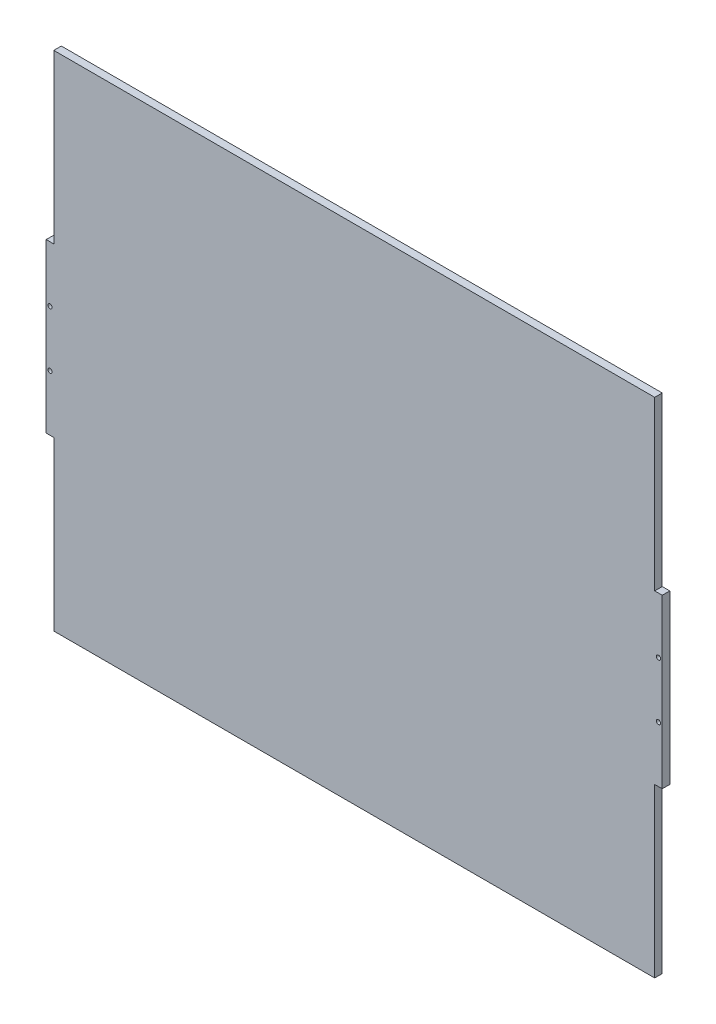
ISO-10303-21;
HEADER;
FILE_DESCRIPTION(('STEP AP214'),'2;1');
FILE_NAME('part.step','',(''),(''),'','','');
FILE_SCHEMA(('AUTOMOTIVE_DESIGN { 1 0 10303 214 1 1 1 1 }'));
ENDSEC;
DATA;
#1=APPLICATION_CONTEXT('core data for automotive mechanical design processes');
#2=APPLICATION_PROTOCOL_DEFINITION('international standard','automotive_design',2000,#1);
#3=PRODUCT_CONTEXT('',#1,'mechanical');
#4=PRODUCT('Part','Part','',(#3));
#5=PRODUCT_RELATED_PRODUCT_CATEGORY('part','',(#4));
#6=PRODUCT_DEFINITION_FORMATION('','',#4);
#7=PRODUCT_DEFINITION_CONTEXT('part definition',#1,'design');
#8=PRODUCT_DEFINITION('design','',#6,#7);
#9=PRODUCT_DEFINITION_SHAPE('','',#8);
#10=(LENGTH_UNIT() NAMED_UNIT(*) SI_UNIT(.MILLI.,.METRE.));
#11=(NAMED_UNIT(*) PLANE_ANGLE_UNIT() SI_UNIT($,.RADIAN.));
#12=(NAMED_UNIT(*) SI_UNIT($,.STERADIAN.) SOLID_ANGLE_UNIT());
#13=UNCERTAINTY_MEASURE_WITH_UNIT(LENGTH_MEASURE(1.E-05),#10,'distance_accuracy_value','');
#14=(GEOMETRIC_REPRESENTATION_CONTEXT(3) GLOBAL_UNCERTAINTY_ASSIGNED_CONTEXT((#13)) GLOBAL_UNIT_ASSIGNED_CONTEXT((#10,
#11,#12)) REPRESENTATION_CONTEXT('',''));
#15=CARTESIAN_POINT('',(0.,0.,0.));
#16=DIRECTION('',(0.,0.,1.));
#17=DIRECTION('',(1.,0.,0.));
#18=AXIS2_PLACEMENT_3D('',#15,#16,#17);
#19=CARTESIAN_POINT('',(0.,0.,6.));
#20=DIRECTION('',(1.,0.,0.));
#21=DIRECTION('',(0.,1.,0.));
#22=AXIS2_PLACEMENT_3D('',#19,#20,#21);
#23=PLANE('',#22);
#24=DIRECTION('',(0.,-1.,0.));
#25=VECTOR('',#24,1.);
#26=CARTESIAN_POINT('',(0.,0.,6.));
#27=LINE('',#26,#25);
#28=CARTESIAN_POINT('',(0.,266.666666666667,6.));
#29=VERTEX_POINT('',#28);
#30=CARTESIAN_POINT('',(0.,133.333333333333,6.));
#31=VERTEX_POINT('',#30);
#32=EDGE_CURVE('E135',#29,#31,#27,.T.);
#33=ORIENTED_EDGE('',*,*,#32,.F.);
#34=DIRECTION('',(0.,0.,1.));
#35=VECTOR('',#34,1.);
#36=CARTESIAN_POINT('',(0.,266.666666666667,-6.));
#37=LINE('',#36,#35);
#38=CARTESIAN_POINT('',(0.,266.666666666667,0.));
#39=VERTEX_POINT('',#38);
#40=EDGE_CURVE('E118',#39,#29,#37,.T.);
#41=ORIENTED_EDGE('',*,*,#40,.F.);
#42=DIRECTION('',(0.,-1.,0.));
#43=VECTOR('',#42,1.);
#44=CARTESIAN_POINT('',(0.,0.,0.));
#45=LINE('',#44,#43);
#46=CARTESIAN_POINT('',(0.,133.333333333333,0.));
#47=VERTEX_POINT('',#46);
#48=EDGE_CURVE('E156',#39,#47,#45,.T.);
#49=ORIENTED_EDGE('',*,*,#48,.T.);
#50=DIRECTION('',(0.,0.,1.));
#51=VECTOR('',#50,1.);
#52=CARTESIAN_POINT('',(0.,133.333333333333,-6.));
#53=LINE('',#52,#51);
#54=EDGE_CURVE('E136',#47,#31,#53,.T.);
#55=ORIENTED_EDGE('',*,*,#54,.T.);
#56=EDGE_LOOP('',(#33,#41,#49,#55));
#57=FACE_BOUND('',#56,.T.);
#58=ADVANCED_FACE('F33',(#57),#23,.F.);
#59=CARTESIAN_POINT('',(0.,0.,6.));
#60=DIRECTION('',(0.,1.,0.));
#61=DIRECTION('',(0.,0.,1.));
#62=AXIS2_PLACEMENT_3D('',#59,#60,#61);
#63=PLANE('',#62);
#64=DIRECTION('',(1.,0.,0.));
#65=VECTOR('',#64,1.);
#66=CARTESIAN_POINT('',(0.,0.,6.));
#67=LINE('',#66,#65);
#68=CARTESIAN_POINT('',(6.00000000000006,0.,6.));
#69=VERTEX_POINT('',#68);
#70=CARTESIAN_POINT('',(484.,0.,6.));
#71=VERTEX_POINT('',#70);
#72=EDGE_CURVE('E139',#69,#71,#67,.T.);
#73=ORIENTED_EDGE('',*,*,#72,.F.);
#74=DIRECTION('',(0.,0.,1.));
#75=VECTOR('',#74,1.);
#76=CARTESIAN_POINT('',(6.00000000000006,0.,-6.));
#77=LINE('',#76,#75);
#78=CARTESIAN_POINT('',(6.00000000000006,0.,0.));
#79=VERTEX_POINT('',#78);
#80=EDGE_CURVE('E186',#79,#69,#77,.T.);
#81=ORIENTED_EDGE('',*,*,#80,.F.);
#82=DIRECTION('',(1.,0.,0.));
#83=VECTOR('',#82,1.);
#84=CARTESIAN_POINT('',(0.,0.,0.));
#85=LINE('',#84,#83);
#86=CARTESIAN_POINT('',(484.,0.,0.));
#87=VERTEX_POINT('',#86);
#88=EDGE_CURVE('E158',#79,#87,#85,.T.);
#89=ORIENTED_EDGE('',*,*,#88,.T.);
#90=DIRECTION('',(0.,0.,1.));
#91=VECTOR('',#90,1.);
#92=CARTESIAN_POINT('',(484.,0.,-6.));
#93=LINE('',#92,#91);
#94=EDGE_CURVE('E206',#87,#71,#93,.T.);
#95=ORIENTED_EDGE('',*,*,#94,.T.);
#96=EDGE_LOOP('',(#73,#81,#89,#95));
#97=FACE_BOUND('',#96,.T.);
#98=ADVANCED_FACE('F190',(#97),#63,.F.);
#99=CARTESIAN_POINT('',(490.,0.,6.));
#100=DIRECTION('',(-1.,0.,0.));
#101=DIRECTION('',(0.,-1.,0.));
#102=AXIS2_PLACEMENT_3D('',#99,#100,#101);
#103=PLANE('',#102);
#104=DIRECTION('',(0.,1.,0.));
#105=VECTOR('',#104,1.);
#106=CARTESIAN_POINT('',(490.,0.,6.));
#107=LINE('',#106,#105);
#108=CARTESIAN_POINT('',(490.,133.333333333333,6.));
#109=VERTEX_POINT('',#108);
#110=CARTESIAN_POINT('',(490.,266.666666666667,6.));
#111=VERTEX_POINT('',#110);
#112=EDGE_CURVE('E143',#109,#111,#107,.T.);
#113=ORIENTED_EDGE('',*,*,#112,.F.);
#114=DIRECTION('',(0.,0.,1.));
#115=VECTOR('',#114,1.);
#116=CARTESIAN_POINT('',(490.,133.333333333333,-6.));
#117=LINE('',#116,#115);
#118=CARTESIAN_POINT('',(490.,133.333333333333,0.));
#119=VERTEX_POINT('',#118);
#120=EDGE_CURVE('E205',#119,#109,#117,.T.);
#121=ORIENTED_EDGE('',*,*,#120,.F.);
#122=DIRECTION('',(0.,1.,0.));
#123=VECTOR('',#122,1.);
#124=CARTESIAN_POINT('',(490.,0.,0.));
#125=LINE('',#124,#123);
#126=CARTESIAN_POINT('',(490.,266.666666666667,0.));
#127=VERTEX_POINT('',#126);
#128=EDGE_CURVE('E146',#119,#127,#125,.T.);
#129=ORIENTED_EDGE('',*,*,#128,.T.);
#130=DIRECTION('',(0.,0.,1.));
#131=VECTOR('',#130,1.);
#132=CARTESIAN_POINT('',(490.,266.666666666667,-6.));
#133=LINE('',#132,#131);
#134=EDGE_CURVE('E159',#127,#111,#133,.T.);
#135=ORIENTED_EDGE('',*,*,#134,.T.);
#136=EDGE_LOOP('',(#113,#121,#129,#135));
#137=FACE_BOUND('',#136,.T.);
#138=ADVANCED_FACE('F248',(#137),#103,.F.);
#139=CARTESIAN_POINT('',(0.,400.,6.));
#140=DIRECTION('',(0.,-1.,0.));
#141=DIRECTION('',(0.,0.,-1.));
#142=AXIS2_PLACEMENT_3D('',#139,#140,#141);
#143=PLANE('',#142);
#144=DIRECTION('',(-1.,0.,0.));
#145=VECTOR('',#144,1.);
#146=CARTESIAN_POINT('',(0.,400.,0.));
#147=LINE('',#146,#145);
#148=CARTESIAN_POINT('',(484.,400.,0.));
#149=VERTEX_POINT('',#148);
#150=CARTESIAN_POINT('',(6.00000000000001,400.,0.));
#151=VERTEX_POINT('',#150);
#152=EDGE_CURVE('E140',#149,#151,#147,.T.);
#153=ORIENTED_EDGE('',*,*,#152,.T.);
#154=DIRECTION('',(0.,0.,1.));
#155=VECTOR('',#154,1.);
#156=CARTESIAN_POINT('',(6.00000000000001,400.,-6.));
#157=LINE('',#156,#155);
#158=CARTESIAN_POINT('',(6.00000000000001,400.,6.));
#159=VERTEX_POINT('',#158);
#160=EDGE_CURVE('E215',#151,#159,#157,.T.);
#161=ORIENTED_EDGE('',*,*,#160,.T.);
#162=DIRECTION('',(-1.,0.,0.));
#163=VECTOR('',#162,1.);
#164=CARTESIAN_POINT('',(0.,400.,6.));
#165=LINE('',#164,#163);
#166=CARTESIAN_POINT('',(484.,400.,6.));
#167=VERTEX_POINT('',#166);
#168=EDGE_CURVE('E153',#167,#159,#165,.T.);
#169=ORIENTED_EDGE('',*,*,#168,.F.);
#170=DIRECTION('',(0.,0.,1.));
#171=VECTOR('',#170,1.);
#172=CARTESIAN_POINT('',(484.,400.,-6.));
#173=LINE('',#172,#171);
#174=EDGE_CURVE('E149',#149,#167,#173,.T.);
#175=ORIENTED_EDGE('',*,*,#174,.F.);
#176=EDGE_LOOP('',(#153,#161,#169,#175));
#177=FACE_BOUND('',#176,.T.);
#178=ADVANCED_FACE('F231',(#177),#143,.F.);
#179=CARTESIAN_POINT('',(0.,0.,6.));
#180=DIRECTION('',(0.,0.,-1.));
#181=DIRECTION('',(-1.,0.,0.));
#182=AXIS2_PLACEMENT_3D('',#179,#180,#181);
#183=PLANE('',#182);
#184=CARTESIAN_POINT('',(2.99999999999994,222.223333333333,6.));
#185=DIRECTION('',(0.,0.,1.));
#186=DIRECTION('',(1.,0.,0.));
#187=AXIS2_PLACEMENT_3D('',#184,#185,#186);
#188=CIRCLE('',#187,1.69999999999999);
#189=CARTESIAN_POINT('',(4.69999999999993,222.223333333333,6.));
#190=VERTEX_POINT('',#189);
#191=EDGE_CURVE('E282',#190,#190,#188,.T.);
#192=ORIENTED_EDGE('',*,*,#191,.F.);
#193=EDGE_LOOP('',(#192));
#194=FACE_BOUND('',#193,.T.);
#195=CARTESIAN_POINT('',(2.99999999999994,177.776666666667,6.));
#196=DIRECTION('',(0.,0.,1.));
#197=DIRECTION('',(1.,0.,0.));
#198=AXIS2_PLACEMENT_3D('',#195,#196,#197);
#199=CIRCLE('',#198,1.69999999999999);
#200=CARTESIAN_POINT('',(4.69999999999993,177.776666666667,6.));
#201=VERTEX_POINT('',#200);
#202=EDGE_CURVE('E286',#201,#201,#199,.T.);
#203=ORIENTED_EDGE('',*,*,#202,.F.);
#204=EDGE_LOOP('',(#203));
#205=FACE_BOUND('',#204,.T.);
#206=CARTESIAN_POINT('',(487.,222.223333333333,6.));
#207=DIRECTION('',(0.,0.,1.));
#208=DIRECTION('',(1.,0.,0.));
#209=AXIS2_PLACEMENT_3D('',#206,#207,#208);
#210=CIRCLE('',#209,1.69999999999998);
#211=CARTESIAN_POINT('',(488.7,222.223333333333,6.));
#212=VERTEX_POINT('',#211);
#213=EDGE_CURVE('E290',#212,#212,#210,.T.);
#214=ORIENTED_EDGE('',*,*,#213,.F.);
#215=EDGE_LOOP('',(#214));
#216=FACE_BOUND('',#215,.T.);
#217=CARTESIAN_POINT('',(487.,177.776666666667,6.));
#218=DIRECTION('',(0.,0.,1.));
#219=DIRECTION('',(1.,0.,0.));
#220=AXIS2_PLACEMENT_3D('',#217,#218,#219);
#221=CIRCLE('',#220,1.69999999999998);
#222=CARTESIAN_POINT('',(488.7,177.776666666667,6.));
#223=VERTEX_POINT('',#222);
#224=EDGE_CURVE('E293',#223,#223,#221,.T.);
#225=ORIENTED_EDGE('',*,*,#224,.F.);
#226=EDGE_LOOP('',(#225));
#227=FACE_BOUND('',#226,.T.);
#228=ORIENTED_EDGE('',*,*,#168,.T.);
#229=DIRECTION('',(0.,1.,0.));
#230=VECTOR('',#229,1.);
#231=CARTESIAN_POINT('',(6.00000000000001,400.,6.));
#232=LINE('',#231,#230);
#233=CARTESIAN_POINT('',(6.00000000000002,266.666666666667,6.));
#234=VERTEX_POINT('',#233);
#235=EDGE_CURVE('E128',#234,#159,#232,.T.);
#236=ORIENTED_EDGE('',*,*,#235,.F.);
#237=DIRECTION('',(1.,0.,0.));
#238=VECTOR('',#237,1.);
#239=CARTESIAN_POINT('',(0.,266.666666666667,6.));
#240=LINE('',#239,#238);
#241=EDGE_CURVE('E121',#29,#234,#240,.T.);
#242=ORIENTED_EDGE('',*,*,#241,.F.);
#243=ORIENTED_EDGE('',*,*,#32,.T.);
#244=DIRECTION('',(-1.,0.,0.));
#245=VECTOR('',#244,1.);
#246=CARTESIAN_POINT('',(0.,133.333333333333,6.));
#247=LINE('',#246,#245);
#248=CARTESIAN_POINT('',(6.00000000000006,133.333333333333,6.));
#249=VERTEX_POINT('',#248);
#250=EDGE_CURVE('E192',#249,#31,#247,.T.);
#251=ORIENTED_EDGE('',*,*,#250,.F.);
#252=DIRECTION('',(0.,1.,0.));
#253=VECTOR('',#252,1.);
#254=CARTESIAN_POINT('',(6.00000000000006,0.,6.));
#255=LINE('',#254,#253);
#256=EDGE_CURVE('E195',#69,#249,#255,.T.);
#257=ORIENTED_EDGE('',*,*,#256,.F.);
#258=ORIENTED_EDGE('',*,*,#72,.T.);
#259=DIRECTION('',(0.,-1.,0.));
#260=VECTOR('',#259,1.);
#261=CARTESIAN_POINT('',(484.,0.,6.));
#262=LINE('',#261,#260);
#263=CARTESIAN_POINT('',(484.,133.333333333333,6.));
#264=VERTEX_POINT('',#263);
#265=EDGE_CURVE('E202',#264,#71,#262,.T.);
#266=ORIENTED_EDGE('',*,*,#265,.F.);
#267=DIRECTION('',(-1.,0.,0.));
#268=VECTOR('',#267,1.);
#269=CARTESIAN_POINT('',(490.,133.333333333333,6.));
#270=LINE('',#269,#268);
#271=EDGE_CURVE('E199',#109,#264,#270,.T.);
#272=ORIENTED_EDGE('',*,*,#271,.F.);
#273=ORIENTED_EDGE('',*,*,#112,.T.);
#274=DIRECTION('',(1.,0.,0.));
#275=VECTOR('',#274,1.);
#276=CARTESIAN_POINT('',(490.,266.666666666667,6.));
#277=LINE('',#276,#275);
#278=CARTESIAN_POINT('',(484.,266.666666666667,6.));
#279=VERTEX_POINT('',#278);
#280=EDGE_CURVE('E214',#279,#111,#277,.T.);
#281=ORIENTED_EDGE('',*,*,#280,.F.);
#282=DIRECTION('',(0.,-1.,0.));
#283=VECTOR('',#282,1.);
#284=CARTESIAN_POINT('',(484.,400.,6.));
#285=LINE('',#284,#283);
#286=EDGE_CURVE('E211',#167,#279,#285,.T.);
#287=ORIENTED_EDGE('',*,*,#286,.F.);
#288=EDGE_LOOP('',(#228,#236,#242,#243,#251,#257,#258,#266,#272,#273,#281,#287));
#289=FACE_BOUND('',#288,.T.);
#290=ADVANCED_FACE('F133',(#194,#205,#216,#227,#289),#183,.F.);
#291=CARTESIAN_POINT('',(0.,0.,0.));
#292=DIRECTION('',(0.,0.,-1.));
#293=DIRECTION('',(-1.,0.,0.));
#294=AXIS2_PLACEMENT_3D('',#291,#292,#293);
#295=PLANE('',#294);
#296=CARTESIAN_POINT('',(2.99999999999994,222.223333333333,0.));
#297=DIRECTION('',(0.,0.,1.));
#298=DIRECTION('',(1.,0.,0.));
#299=AXIS2_PLACEMENT_3D('',#296,#297,#298);
#300=CIRCLE('',#299,1.69999999999999);
#301=CARTESIAN_POINT('',(4.69999999999993,222.223333333333,0.));
#302=VERTEX_POINT('',#301);
#303=EDGE_CURVE('E307',#302,#302,#300,.T.);
#304=ORIENTED_EDGE('',*,*,#303,.T.);
#305=EDGE_LOOP('',(#304));
#306=FACE_BOUND('',#305,.T.);
#307=CARTESIAN_POINT('',(2.99999999999994,177.776666666667,0.));
#308=DIRECTION('',(0.,0.,1.));
#309=DIRECTION('',(1.,0.,0.));
#310=AXIS2_PLACEMENT_3D('',#307,#308,#309);
#311=CIRCLE('',#310,1.69999999999999);
#312=CARTESIAN_POINT('',(4.69999999999993,177.776666666667,0.));
#313=VERTEX_POINT('',#312);
#314=EDGE_CURVE('E303',#313,#313,#311,.T.);
#315=ORIENTED_EDGE('',*,*,#314,.T.);
#316=EDGE_LOOP('',(#315));
#317=FACE_BOUND('',#316,.T.);
#318=CARTESIAN_POINT('',(487.,222.223333333333,0.));
#319=DIRECTION('',(0.,0.,1.));
#320=DIRECTION('',(1.,0.,0.));
#321=AXIS2_PLACEMENT_3D('',#318,#319,#320);
#322=CIRCLE('',#321,1.69999999999998);
#323=CARTESIAN_POINT('',(488.7,222.223333333333,0.));
#324=VERTEX_POINT('',#323);
#325=EDGE_CURVE('E295',#324,#324,#322,.T.);
#326=ORIENTED_EDGE('',*,*,#325,.T.);
#327=EDGE_LOOP('',(#326));
#328=FACE_BOUND('',#327,.T.);
#329=CARTESIAN_POINT('',(487.,177.776666666667,0.));
#330=DIRECTION('',(0.,0.,1.));
#331=DIRECTION('',(1.,0.,0.));
#332=AXIS2_PLACEMENT_3D('',#329,#330,#331);
#333=CIRCLE('',#332,1.69999999999998);
#334=CARTESIAN_POINT('',(488.7,177.776666666667,0.));
#335=VERTEX_POINT('',#334);
#336=EDGE_CURVE('E203',#335,#335,#333,.T.);
#337=ORIENTED_EDGE('',*,*,#336,.T.);
#338=EDGE_LOOP('',(#337));
#339=FACE_BOUND('',#338,.T.);
#340=DIRECTION('',(0.,-1.,0.));
#341=VECTOR('',#340,1.);
#342=CARTESIAN_POINT('',(6.00000000000006,0.,0.));
#343=LINE('',#342,#341);
#344=CARTESIAN_POINT('',(6.00000000000002,266.666666666667,0.));
#345=VERTEX_POINT('',#344);
#346=EDGE_CURVE('E11',#151,#345,#343,.T.);
#347=ORIENTED_EDGE('',*,*,#346,.F.);
#348=ORIENTED_EDGE('',*,*,#152,.F.);
#349=DIRECTION('',(0.,1.,0.));
#350=VECTOR('',#349,1.);
#351=CARTESIAN_POINT('',(484.,0.,0.));
#352=LINE('',#351,#350);
#353=CARTESIAN_POINT('',(484.,266.666666666667,0.));
#354=VERTEX_POINT('',#353);
#355=EDGE_CURVE('E155',#354,#149,#352,.T.);
#356=ORIENTED_EDGE('',*,*,#355,.F.);
#357=DIRECTION('',(-1.,0.,0.));
#358=VECTOR('',#357,1.);
#359=CARTESIAN_POINT('',(0.,266.666666666667,0.));
#360=LINE('',#359,#358);
#361=EDGE_CURVE('E164',#127,#354,#360,.T.);
#362=ORIENTED_EDGE('',*,*,#361,.F.);
#363=ORIENTED_EDGE('',*,*,#128,.F.);
#364=DIRECTION('',(1.,0.,0.));
#365=VECTOR('',#364,1.);
#366=CARTESIAN_POINT('',(0.,133.333333333333,0.));
#367=LINE('',#366,#365);
#368=CARTESIAN_POINT('',(484.,133.333333333333,0.));
#369=VERTEX_POINT('',#368);
#370=EDGE_CURVE('E167',#369,#119,#367,.T.);
#371=ORIENTED_EDGE('',*,*,#370,.F.);
#372=DIRECTION('',(0.,1.,0.));
#373=VECTOR('',#372,1.);
#374=CARTESIAN_POINT('',(484.,0.,0.));
#375=LINE('',#374,#373);
#376=EDGE_CURVE('E169',#87,#369,#375,.T.);
#377=ORIENTED_EDGE('',*,*,#376,.F.);
#378=ORIENTED_EDGE('',*,*,#88,.F.);
#379=DIRECTION('',(0.,-1.,0.));
#380=VECTOR('',#379,1.);
#381=CARTESIAN_POINT('',(6.00000000000006,0.,0.));
#382=LINE('',#381,#380);
#383=CARTESIAN_POINT('',(6.00000000000006,133.333333333333,0.));
#384=VERTEX_POINT('',#383);
#385=EDGE_CURVE('E172',#384,#79,#382,.T.);
#386=ORIENTED_EDGE('',*,*,#385,.F.);
#387=DIRECTION('',(1.,0.,0.));
#388=VECTOR('',#387,1.);
#389=CARTESIAN_POINT('',(0.,133.333333333333,0.));
#390=LINE('',#389,#388);
#391=EDGE_CURVE('E174',#47,#384,#390,.T.);
#392=ORIENTED_EDGE('',*,*,#391,.F.);
#393=ORIENTED_EDGE('',*,*,#48,.F.);
#394=DIRECTION('',(-1.,0.,0.));
#395=VECTOR('',#394,1.);
#396=CARTESIAN_POINT('',(4.93432455388952E-12,266.666666666667,0.));
#397=LINE('',#396,#395);
#398=EDGE_CURVE('E40',#345,#39,#397,.T.);
#399=ORIENTED_EDGE('',*,*,#398,.F.);
#400=EDGE_LOOP('',(#347,#348,#356,#362,#363,#371,#377,#378,#386,#392,#393,#399));
#401=FACE_BOUND('',#400,.T.);
#402=ADVANCED_FACE('F182',(#306,#317,#328,#339,#401),#295,.T.);
#403=CARTESIAN_POINT('',(490.,266.666666666667,-6.));
#404=DIRECTION('',(0.,-1.,0.));
#405=DIRECTION('',(0.,0.,-1.));
#406=AXIS2_PLACEMENT_3D('',#403,#404,#405);
#407=PLANE('',#406);
#408=ORIENTED_EDGE('',*,*,#361,.T.);
#409=DIRECTION('',(0.,0.,1.));
#410=VECTOR('',#409,1.);
#411=CARTESIAN_POINT('',(484.,266.666666666667,-6.));
#412=LINE('',#411,#410);
#413=EDGE_CURVE('E219',#354,#279,#412,.T.);
#414=ORIENTED_EDGE('',*,*,#413,.T.);
#415=ORIENTED_EDGE('',*,*,#280,.T.);
#416=ORIENTED_EDGE('',*,*,#134,.F.);
#417=EDGE_LOOP('',(#408,#414,#415,#416));
#418=FACE_BOUND('',#417,.T.);
#419=ADVANCED_FACE('F251',(#418),#407,.F.);
#420=CARTESIAN_POINT('',(484.,400.,-6.));
#421=DIRECTION('',(-1.,0.,0.));
#422=DIRECTION('',(0.,0.,1.));
#423=AXIS2_PLACEMENT_3D('',#420,#421,#422);
#424=PLANE('',#423);
#425=ORIENTED_EDGE('',*,*,#355,.T.);
#426=ORIENTED_EDGE('',*,*,#174,.T.);
#427=ORIENTED_EDGE('',*,*,#286,.T.);
#428=ORIENTED_EDGE('',*,*,#413,.F.);
#429=EDGE_LOOP('',(#425,#426,#427,#428));
#430=FACE_BOUND('',#429,.T.);
#431=ADVANCED_FACE('F224',(#430),#424,.F.);
#432=CARTESIAN_POINT('',(484.,0.,-6.));
#433=DIRECTION('',(-1.,0.,0.));
#434=DIRECTION('',(0.,0.,1.));
#435=AXIS2_PLACEMENT_3D('',#432,#433,#434);
#436=PLANE('',#435);
#437=ORIENTED_EDGE('',*,*,#376,.T.);
#438=DIRECTION('',(0.,0.,1.));
#439=VECTOR('',#438,1.);
#440=CARTESIAN_POINT('',(484.,133.333333333333,-6.));
#441=LINE('',#440,#439);
#442=EDGE_CURVE('E208',#369,#264,#441,.T.);
#443=ORIENTED_EDGE('',*,*,#442,.T.);
#444=ORIENTED_EDGE('',*,*,#265,.T.);
#445=ORIENTED_EDGE('',*,*,#94,.F.);
#446=EDGE_LOOP('',(#437,#443,#444,#445));
#447=FACE_BOUND('',#446,.T.);
#448=ADVANCED_FACE('F241',(#447),#436,.F.);
#449=CARTESIAN_POINT('',(490.,133.333333333333,-6.));
#450=DIRECTION('',(0.,1.,0.));
#451=DIRECTION('',(0.,0.,1.));
#452=AXIS2_PLACEMENT_3D('',#449,#450,#451);
#453=PLANE('',#452);
#454=ORIENTED_EDGE('',*,*,#370,.T.);
#455=ORIENTED_EDGE('',*,*,#120,.T.);
#456=ORIENTED_EDGE('',*,*,#271,.T.);
#457=ORIENTED_EDGE('',*,*,#442,.F.);
#458=EDGE_LOOP('',(#454,#455,#456,#457));
#459=FACE_BOUND('',#458,.T.);
#460=ADVANCED_FACE('F244',(#459),#453,.F.);
#461=CARTESIAN_POINT('',(0.,133.333333333333,-6.));
#462=DIRECTION('',(0.,1.,0.));
#463=DIRECTION('',(0.,0.,1.));
#464=AXIS2_PLACEMENT_3D('',#461,#462,#463);
#465=PLANE('',#464);
#466=ORIENTED_EDGE('',*,*,#391,.T.);
#467=DIRECTION('',(0.,0.,1.));
#468=VECTOR('',#467,1.);
#469=CARTESIAN_POINT('',(6.00000000000006,133.333333333333,-6.));
#470=LINE('',#469,#468);
#471=EDGE_CURVE('E54',#384,#249,#470,.T.);
#472=ORIENTED_EDGE('',*,*,#471,.T.);
#473=ORIENTED_EDGE('',*,*,#250,.T.);
#474=ORIENTED_EDGE('',*,*,#54,.F.);
#475=EDGE_LOOP('',(#466,#472,#473,#474));
#476=FACE_BOUND('',#475,.T.);
#477=ADVANCED_FACE('F178',(#476),#465,.F.);
#478=CARTESIAN_POINT('',(6.00000000000006,0.,-6.));
#479=DIRECTION('',(1.,0.,0.));
#480=DIRECTION('',(0.,1.,0.));
#481=AXIS2_PLACEMENT_3D('',#478,#479,#480);
#482=PLANE('',#481);
#483=ORIENTED_EDGE('',*,*,#385,.T.);
#484=ORIENTED_EDGE('',*,*,#80,.T.);
#485=ORIENTED_EDGE('',*,*,#256,.T.);
#486=ORIENTED_EDGE('',*,*,#471,.F.);
#487=EDGE_LOOP('',(#483,#484,#485,#486));
#488=FACE_BOUND('',#487,.T.);
#489=ADVANCED_FACE('F185',(#488),#482,.F.);
#490=CARTESIAN_POINT('',(6.00000000000001,400.,-6.));
#491=DIRECTION('',(1.,0.,0.));
#492=DIRECTION('',(0.,1.,0.));
#493=AXIS2_PLACEMENT_3D('',#490,#491,#492);
#494=PLANE('',#493);
#495=ORIENTED_EDGE('',*,*,#346,.T.);
#496=DIRECTION('',(0.,0.,1.));
#497=VECTOR('',#496,1.);
#498=CARTESIAN_POINT('',(6.00000000000002,266.666666666667,-6.));
#499=LINE('',#498,#497);
#500=EDGE_CURVE('E47',#345,#234,#499,.T.);
#501=ORIENTED_EDGE('',*,*,#500,.T.);
#502=ORIENTED_EDGE('',*,*,#235,.T.);
#503=ORIENTED_EDGE('',*,*,#160,.F.);
#504=EDGE_LOOP('',(#495,#501,#502,#503));
#505=FACE_BOUND('',#504,.T.);
#506=ADVANCED_FACE('F331',(#505),#494,.F.);
#507=CARTESIAN_POINT('',(0.,266.666666666667,-6.));
#508=DIRECTION('',(0.,-1.,0.));
#509=DIRECTION('',(1.,0.,0.));
#510=AXIS2_PLACEMENT_3D('',#507,#508,#509);
#511=PLANE('',#510);
#512=ORIENTED_EDGE('',*,*,#398,.T.);
#513=ORIENTED_EDGE('',*,*,#40,.T.);
#514=ORIENTED_EDGE('',*,*,#241,.T.);
#515=ORIENTED_EDGE('',*,*,#500,.F.);
#516=EDGE_LOOP('',(#512,#513,#514,#515));
#517=FACE_BOUND('',#516,.T.);
#518=ADVANCED_FACE('F120',(#517),#511,.F.);
#519=CARTESIAN_POINT('',(487.,177.776666666667,6.));
#520=DIRECTION('',(0.,0.,1.));
#521=DIRECTION('',(1.,0.,0.));
#522=AXIS2_PLACEMENT_3D('',#519,#520,#521);
#523=CYLINDRICAL_SURFACE('',#522,1.69999999999998);
#524=ORIENTED_EDGE('',*,*,#336,.F.);
#525=EDGE_LOOP('',(#524));
#526=FACE_BOUND('',#525,.T.);
#527=ORIENTED_EDGE('',*,*,#224,.T.);
#528=EDGE_LOOP('',(#527));
#529=FACE_BOUND('',#528,.T.);
#530=ADVANCED_FACE('F326',(#526,#529),#523,.F.);
#531=CARTESIAN_POINT('',(487.,222.223333333333,6.));
#532=DIRECTION('',(0.,0.,1.));
#533=DIRECTION('',(1.,0.,0.));
#534=AXIS2_PLACEMENT_3D('',#531,#532,#533);
#535=CYLINDRICAL_SURFACE('',#534,1.69999999999998);
#536=ORIENTED_EDGE('',*,*,#325,.F.);
#537=EDGE_LOOP('',(#536));
#538=FACE_BOUND('',#537,.T.);
#539=ORIENTED_EDGE('',*,*,#213,.T.);
#540=EDGE_LOOP('',(#539));
#541=FACE_BOUND('',#540,.T.);
#542=ADVANCED_FACE('F319',(#538,#541),#535,.F.);
#543=CARTESIAN_POINT('',(2.99999999999994,177.776666666667,6.));
#544=DIRECTION('',(0.,0.,1.));
#545=DIRECTION('',(1.,0.,0.));
#546=AXIS2_PLACEMENT_3D('',#543,#544,#545);
#547=CYLINDRICAL_SURFACE('',#546,1.69999999999999);
#548=ORIENTED_EDGE('',*,*,#314,.F.);
#549=EDGE_LOOP('',(#548));
#550=FACE_BOUND('',#549,.T.);
#551=ORIENTED_EDGE('',*,*,#202,.T.);
#552=EDGE_LOOP('',(#551));
#553=FACE_BOUND('',#552,.T.);
#554=ADVANCED_FACE('F313',(#550,#553),#547,.F.);
#555=CARTESIAN_POINT('',(2.99999999999994,222.223333333333,6.));
#556=DIRECTION('',(0.,0.,1.));
#557=DIRECTION('',(1.,0.,0.));
#558=AXIS2_PLACEMENT_3D('',#555,#556,#557);
#559=CYLINDRICAL_SURFACE('',#558,1.69999999999999);
#560=ORIENTED_EDGE('',*,*,#303,.F.);
#561=EDGE_LOOP('',(#560));
#562=FACE_BOUND('',#561,.T.);
#563=ORIENTED_EDGE('',*,*,#191,.T.);
#564=EDGE_LOOP('',(#563));
#565=FACE_BOUND('',#564,.T.);
#566=ADVANCED_FACE('F311',(#562,#565),#559,.F.);
#567=CLOSED_SHELL('',(#58,#98,#138,#178,#290,#402,#419,#431,#448,#460,#477,#489,#506,#518,#530,
#542,#554,#566));
#568=MANIFOLD_SOLID_BREP('B2',#567);
#569=ADVANCED_BREP_SHAPE_REPRESENTATION('',(#18,#568),#14);
#570=SHAPE_DEFINITION_REPRESENTATION(#9,#569);
ENDSEC;
END-ISO-10303-21;
